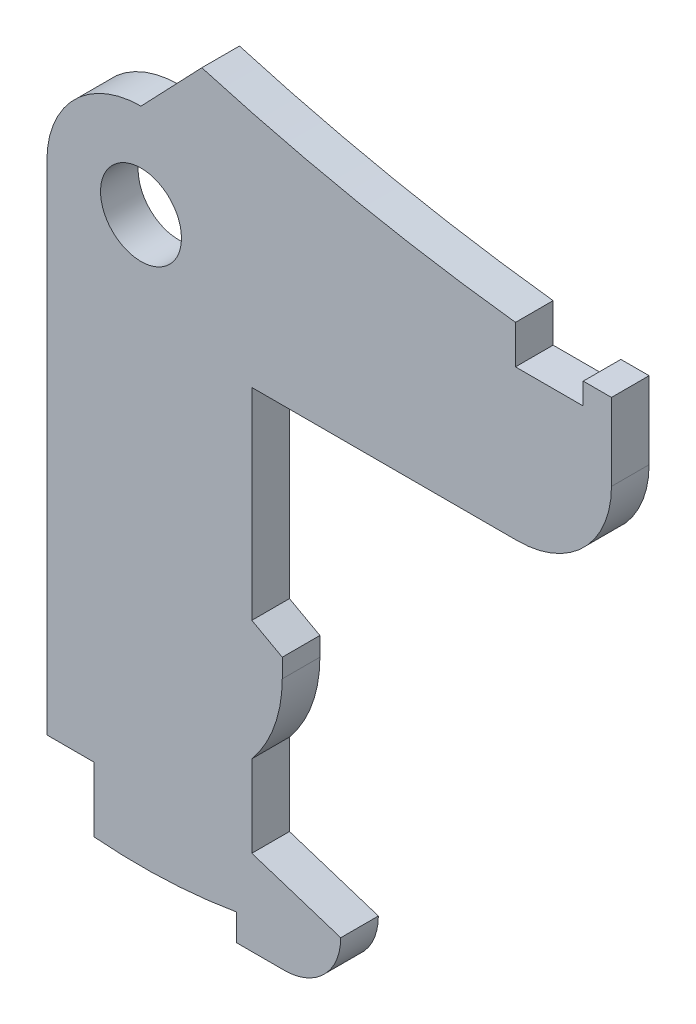
ISO-10303-21;
HEADER;
FILE_DESCRIPTION(('STEP AP214'),'2;1');
FILE_NAME('part.step','',(''),(''),'','','');
FILE_SCHEMA(('AUTOMOTIVE_DESIGN { 1 0 10303 214 1 1 1 1 }'));
ENDSEC;
DATA;
#1=APPLICATION_CONTEXT('core data for automotive mechanical design processes');
#2=APPLICATION_PROTOCOL_DEFINITION('international standard','automotive_design',2000,#1);
#3=PRODUCT_CONTEXT('',#1,'mechanical');
#4=PRODUCT('Part','Part','',(#3));
#5=PRODUCT_RELATED_PRODUCT_CATEGORY('part','',(#4));
#6=PRODUCT_DEFINITION_FORMATION('','',#4);
#7=PRODUCT_DEFINITION_CONTEXT('part definition',#1,'design');
#8=PRODUCT_DEFINITION('design','',#6,#7);
#9=PRODUCT_DEFINITION_SHAPE('','',#8);
#10=(LENGTH_UNIT() NAMED_UNIT(*) SI_UNIT(.MILLI.,.METRE.));
#11=(NAMED_UNIT(*) PLANE_ANGLE_UNIT() SI_UNIT($,.RADIAN.));
#12=(NAMED_UNIT(*) SI_UNIT($,.STERADIAN.) SOLID_ANGLE_UNIT());
#13=UNCERTAINTY_MEASURE_WITH_UNIT(LENGTH_MEASURE(1.E-05),#10,'distance_accuracy_value','');
#14=(GEOMETRIC_REPRESENTATION_CONTEXT(3) GLOBAL_UNCERTAINTY_ASSIGNED_CONTEXT((#13)) GLOBAL_UNIT_ASSIGNED_CONTEXT((#10,
#11,#12)) REPRESENTATION_CONTEXT('',''));
#15=CARTESIAN_POINT('',(0.,0.,0.));
#16=DIRECTION('',(0.,0.,1.));
#17=DIRECTION('',(1.,0.,0.));
#18=AXIS2_PLACEMENT_3D('',#15,#16,#17);
#19=CARTESIAN_POINT('',(0.,-69.1109493092821,2.));
#20=DIRECTION('',(0.,1.,0.));
#21=DIRECTION('',(0.,0.,1.));
#22=AXIS2_PLACEMENT_3D('',#19,#20,#21);
#23=PLANE('',#22);
#24=DIRECTION('',(1.,0.,0.));
#25=VECTOR('',#24,1.);
#26=CARTESIAN_POINT('',(0.,-69.1109493092821,0.));
#27=LINE('',#26,#25);
#28=CARTESIAN_POINT('',(58.5628566486414,-69.1109493092821,0.));
#29=VERTEX_POINT('',#28);
#30=CARTESIAN_POINT('',(61.1004317090133,-69.1109493092821,0.));
#31=VERTEX_POINT('',#30);
#32=EDGE_CURVE('E227',#29,#31,#27,.T.);
#33=ORIENTED_EDGE('',*,*,#32,.T.);
#34=DIRECTION('',(0.,0.,-1.));
#35=VECTOR('',#34,1.);
#36=CARTESIAN_POINT('',(61.1004317090133,-69.1109493092821,2.));
#37=LINE('',#36,#35);
#38=CARTESIAN_POINT('',(61.1004317090133,-69.1109493092821,2.));
#39=VERTEX_POINT('',#38);
#40=EDGE_CURVE('E11',#39,#31,#37,.T.);
#41=ORIENTED_EDGE('',*,*,#40,.F.);
#42=DIRECTION('',(1.,0.,0.));
#43=VECTOR('',#42,1.);
#44=CARTESIAN_POINT('',(0.,-69.1109493092821,2.));
#45=LINE('',#44,#43);
#46=CARTESIAN_POINT('',(58.5628566486414,-69.1109493092821,2.));
#47=VERTEX_POINT('',#46);
#48=EDGE_CURVE('E399',#47,#39,#45,.T.);
#49=ORIENTED_EDGE('',*,*,#48,.F.);
#50=DIRECTION('',(0.,0.,-1.));
#51=VECTOR('',#50,1.);
#52=CARTESIAN_POINT('',(58.5628566486414,-69.1109493092821,2.));
#53=LINE('',#52,#51);
#54=EDGE_CURVE('E223',#47,#29,#53,.T.);
#55=ORIENTED_EDGE('',*,*,#54,.T.);
#56=EDGE_LOOP('',(#33,#41,#49,#55));
#57=FACE_BOUND('',#56,.T.);
#58=ADVANCED_FACE('F35',(#57),#23,.F.);
#59=CARTESIAN_POINT('',(61.1004317090133,-66.1109493092821,2.));
#60=DIRECTION('',(0.,0.,-1.));
#61=DIRECTION('',(-1.,0.,0.));
#62=AXIS2_PLACEMENT_3D('',#59,#60,#61);
#63=CYLINDRICAL_SURFACE('',#62,3.00000000000001);
#64=CARTESIAN_POINT('',(61.1004317090133,-66.1109493092821,0.));
#65=DIRECTION('',(0.,0.,1.));
#66=DIRECTION('',(1.,0.,0.));
#67=AXIS2_PLACEMENT_3D('',#64,#65,#66);
#68=CIRCLE('',#67,3.00000000000001);
#69=CARTESIAN_POINT('',(64.1004317090133,-66.1109493092821,0.));
#70=VERTEX_POINT('',#69);
#71=EDGE_CURVE('E230',#31,#70,#68,.T.);
#72=ORIENTED_EDGE('',*,*,#71,.T.);
#73=DIRECTION('',(0.,0.,-1.));
#74=VECTOR('',#73,1.);
#75=CARTESIAN_POINT('',(64.1004317090133,-66.1109493092821,2.));
#76=LINE('',#75,#74);
#77=CARTESIAN_POINT('',(64.1004317090133,-66.1109493092821,2.));
#78=VERTEX_POINT('',#77);
#79=EDGE_CURVE('E44',#78,#70,#76,.T.);
#80=ORIENTED_EDGE('',*,*,#79,.F.);
#81=CARTESIAN_POINT('',(61.1004317090133,-66.1109493092821,2.));
#82=DIRECTION('',(0.,0.,1.));
#83=DIRECTION('',(1.,0.,0.));
#84=AXIS2_PLACEMENT_3D('',#81,#82,#83);
#85=CIRCLE('',#84,3.00000000000001);
#86=EDGE_CURVE('E139',#39,#78,#85,.T.);
#87=ORIENTED_EDGE('',*,*,#86,.F.);
#88=ORIENTED_EDGE('',*,*,#40,.T.);
#89=EDGE_LOOP('',(#72,#80,#87,#88));
#90=FACE_BOUND('',#89,.T.);
#91=ADVANCED_FACE('F413',(#90),#63,.T.);
#92=CARTESIAN_POINT('',(-13.2752413972475,-41.1476724947514,2.));
#93=DIRECTION('',(-0.307040459564451,-0.951696462213899,0.));
#94=DIRECTION('',(0.951696462213899,-0.307040459564451,0.));
#95=AXIS2_PLACEMENT_3D('',#92,#93,#94);
#96=PLANE('',#95);
#97=DIRECTION('',(-0.951696462213899,0.307040459564451,0.));
#98=VECTOR('',#97,1.);
#99=CARTESIAN_POINT('',(-13.2752413972475,-41.1476724947514,0.));
#100=LINE('',#99,#98);
#101=CARTESIAN_POINT('',(59.3761202637687,-64.5867713650885,0.));
#102=VERTEX_POINT('',#101);
#103=EDGE_CURVE('E232',#70,#102,#100,.T.);
#104=ORIENTED_EDGE('',*,*,#103,.T.);
#105=DIRECTION('',(0.,0.,-1.));
#106=VECTOR('',#105,1.);
#107=CARTESIAN_POINT('',(59.3761202637687,-64.5867713650885,2.));
#108=LINE('',#107,#106);
#109=CARTESIAN_POINT('',(59.3761202637687,-64.5867713650885,2.));
#110=VERTEX_POINT('',#109);
#111=EDGE_CURVE('E325',#110,#102,#108,.T.);
#112=ORIENTED_EDGE('',*,*,#111,.F.);
#113=DIRECTION('',(-0.951696462213899,0.307040459564451,0.));
#114=VECTOR('',#113,1.);
#115=CARTESIAN_POINT('',(-13.2752413972475,-41.1476724947514,2.));
#116=LINE('',#115,#114);
#117=EDGE_CURVE('E332',#78,#110,#116,.T.);
#118=ORIENTED_EDGE('',*,*,#117,.F.);
#119=ORIENTED_EDGE('',*,*,#79,.T.);
#120=EDGE_LOOP('',(#104,#112,#118,#119));
#121=FACE_BOUND('',#120,.T.);
#122=ADVANCED_FACE('F330',(#121),#96,.F.);
#123=CARTESIAN_POINT('',(59.3761202637687,0.,2.));
#124=DIRECTION('',(1.,0.,0.));
#125=DIRECTION('',(0.,0.,-1.));
#126=AXIS2_PLACEMENT_3D('',#123,#124,#125);
#127=PLANE('',#126);
#128=DIRECTION('',(0.,-1.,0.));
#129=VECTOR('',#128,1.);
#130=CARTESIAN_POINT('',(59.3761202637687,0.,0.));
#131=LINE('',#130,#129);
#132=CARTESIAN_POINT('',(59.3761202637687,-60.2400285328767,0.));
#133=VERTEX_POINT('',#132);
#134=EDGE_CURVE('E235',#133,#102,#131,.T.);
#135=ORIENTED_EDGE('',*,*,#134,.F.);
#136=DIRECTION('',(0.,0.,-1.));
#137=VECTOR('',#136,1.);
#138=CARTESIAN_POINT('',(59.3761202637687,-60.2400285328767,2.));
#139=LINE('',#138,#137);
#140=CARTESIAN_POINT('',(59.3761202637687,-60.2400285328767,2.));
#141=VERTEX_POINT('',#140);
#142=EDGE_CURVE('E323',#141,#133,#139,.T.);
#143=ORIENTED_EDGE('',*,*,#142,.F.);
#144=DIRECTION('',(0.,-1.,0.));
#145=VECTOR('',#144,1.);
#146=CARTESIAN_POINT('',(59.3761202637687,0.,2.));
#147=LINE('',#146,#145);
#148=EDGE_CURVE('E343',#141,#110,#147,.T.);
#149=ORIENTED_EDGE('',*,*,#148,.T.);
#150=ORIENTED_EDGE('',*,*,#111,.T.);
#151=EDGE_LOOP('',(#135,#143,#149,#150));
#152=FACE_BOUND('',#151,.T.);
#153=ADVANCED_FACE('F340',(#152),#127,.T.);
#154=CARTESIAN_POINT('',(53.95842090491,-55.7530720627505,2.));
#155=DIRECTION('',(0.,0.,-1.));
#156=DIRECTION('',(-1.,0.,0.));
#157=AXIS2_PLACEMENT_3D('',#154,#155,#156);
#158=CYLINDRICAL_SURFACE('',#157,7.03450387076339);
#159=CARTESIAN_POINT('',(53.95842090491,-55.7530720627505,0.));
#160=DIRECTION('',(0.,0.,1.));
#161=DIRECTION('',(1.,0.,0.));
#162=AXIS2_PLACEMENT_3D('',#159,#160,#161);
#163=CIRCLE('',#162,7.03450387076339);
#164=CARTESIAN_POINT('',(60.9929247756734,-55.7530720627505,0.));
#165=VERTEX_POINT('',#164);
#166=EDGE_CURVE('E238',#165,#133,#163,.F.);
#167=ORIENTED_EDGE('',*,*,#166,.F.);
#168=DIRECTION('',(0.,0.,-1.));
#169=VECTOR('',#168,1.);
#170=CARTESIAN_POINT('',(60.9929247756734,-55.7530720627505,2.));
#171=LINE('',#170,#169);
#172=CARTESIAN_POINT('',(60.9929247756734,-55.7530720627505,2.));
#173=VERTEX_POINT('',#172);
#174=EDGE_CURVE('E321',#173,#165,#171,.T.);
#175=ORIENTED_EDGE('',*,*,#174,.F.);
#176=CARTESIAN_POINT('',(53.95842090491,-55.7530720627505,2.));
#177=DIRECTION('',(0.,0.,1.));
#178=DIRECTION('',(1.,0.,0.));
#179=AXIS2_PLACEMENT_3D('',#176,#177,#178);
#180=CIRCLE('',#179,7.03450387076339);
#181=EDGE_CURVE('E346',#173,#141,#180,.F.);
#182=ORIENTED_EDGE('',*,*,#181,.T.);
#183=ORIENTED_EDGE('',*,*,#142,.T.);
#184=EDGE_LOOP('',(#167,#175,#182,#183));
#185=FACE_BOUND('',#184,.T.);
#186=ADVANCED_FACE('F423',(#185),#158,.T.);
#187=CARTESIAN_POINT('',(60.9929247756734,0.,2.));
#188=DIRECTION('',(-1.,0.,0.));
#189=DIRECTION('',(0.,0.,1.));
#190=AXIS2_PLACEMENT_3D('',#187,#188,#189);
#191=PLANE('',#190);
#192=DIRECTION('',(0.,1.,0.));
#193=VECTOR('',#192,1.);
#194=CARTESIAN_POINT('',(60.9929247756734,0.,0.));
#195=LINE('',#194,#193);
#196=CARTESIAN_POINT('',(60.9929247756734,-54.7553142853299,0.));
#197=VERTEX_POINT('',#196);
#198=EDGE_CURVE('E241',#165,#197,#195,.T.);
#199=ORIENTED_EDGE('',*,*,#198,.T.);
#200=DIRECTION('',(0.,0.,-1.));
#201=VECTOR('',#200,1.);
#202=CARTESIAN_POINT('',(60.9929247756734,-54.7553142853299,2.));
#203=LINE('',#202,#201);
#204=CARTESIAN_POINT('',(60.9929247756734,-54.7553142853299,2.));
#205=VERTEX_POINT('',#204);
#206=EDGE_CURVE('E318',#205,#197,#203,.T.);
#207=ORIENTED_EDGE('',*,*,#206,.F.);
#208=DIRECTION('',(0.,1.,0.));
#209=VECTOR('',#208,1.);
#210=CARTESIAN_POINT('',(60.9929247756734,0.,2.));
#211=LINE('',#210,#209);
#212=EDGE_CURVE('E348',#173,#205,#211,.T.);
#213=ORIENTED_EDGE('',*,*,#212,.F.);
#214=ORIENTED_EDGE('',*,*,#174,.T.);
#215=EDGE_LOOP('',(#199,#207,#213,#214));
#216=FACE_BOUND('',#215,.T.);
#217=ADVANCED_FACE('F426',(#216),#191,.F.);
#218=CARTESIAN_POINT('',(-8.97597044556049,-16.3550723728844,2.));
#219=DIRECTION('',(-0.481123509234274,-0.876652821168162,0.));
#220=DIRECTION('',(0.876652821168162,-0.481123509234274,0.));
#221=AXIS2_PLACEMENT_3D('',#218,#219,#220);
#222=PLANE('',#221);
#223=DIRECTION('',(-0.876652821168162,0.481123509234274,0.));
#224=VECTOR('',#223,1.);
#225=CARTESIAN_POINT('',(-8.97597044556049,-16.3550723728844,0.));
#226=LINE('',#225,#224);
#227=CARTESIAN_POINT('',(59.3761202637687,-53.8679816472202,0.));
#228=VERTEX_POINT('',#227);
#229=EDGE_CURVE('E243',#197,#228,#226,.T.);
#230=ORIENTED_EDGE('',*,*,#229,.T.);
#231=DIRECTION('',(0.,0.,-1.));
#232=VECTOR('',#231,1.);
#233=CARTESIAN_POINT('',(59.3761202637687,-53.8679816472202,2.));
#234=LINE('',#233,#232);
#235=CARTESIAN_POINT('',(59.3761202637687,-53.8679816472202,2.));
#236=VERTEX_POINT('',#235);
#237=EDGE_CURVE('E316',#236,#228,#234,.T.);
#238=ORIENTED_EDGE('',*,*,#237,.F.);
#239=DIRECTION('',(-0.876652821168162,0.481123509234274,0.));
#240=VECTOR('',#239,1.);
#241=CARTESIAN_POINT('',(-8.97597044556049,-16.3550723728844,2.));
#242=LINE('',#241,#240);
#243=EDGE_CURVE('E354',#205,#236,#242,.T.);
#244=ORIENTED_EDGE('',*,*,#243,.F.);
#245=ORIENTED_EDGE('',*,*,#206,.T.);
#246=EDGE_LOOP('',(#230,#238,#244,#245));
#247=FACE_BOUND('',#246,.T.);
#248=ADVANCED_FACE('F430',(#247),#222,.F.);
#249=CARTESIAN_POINT('',(59.3761202637687,0.,2.));
#250=DIRECTION('',(1.,0.,0.));
#251=DIRECTION('',(0.,0.,-1.));
#252=AXIS2_PLACEMENT_3D('',#249,#250,#251);
#253=PLANE('',#252);
#254=DIRECTION('',(0.,-1.,0.));
#255=VECTOR('',#254,1.);
#256=CARTESIAN_POINT('',(59.3761202637687,0.,0.));
#257=LINE('',#256,#255);
#258=CARTESIAN_POINT('',(59.3761202637687,-43.149191929352,0.));
#259=VERTEX_POINT('',#258);
#260=EDGE_CURVE('E246',#259,#228,#257,.T.);
#261=ORIENTED_EDGE('',*,*,#260,.F.);
#262=DIRECTION('',(0.,0.,-1.));
#263=VECTOR('',#262,1.);
#264=CARTESIAN_POINT('',(59.3761202637687,-43.149191929352,2.));
#265=LINE('',#264,#263);
#266=CARTESIAN_POINT('',(59.3761202637687,-43.149191929352,2.));
#267=VERTEX_POINT('',#266);
#268=EDGE_CURVE('E314',#267,#259,#265,.T.);
#269=ORIENTED_EDGE('',*,*,#268,.F.);
#270=DIRECTION('',(0.,-1.,0.));
#271=VECTOR('',#270,1.);
#272=CARTESIAN_POINT('',(59.3761202637687,0.,2.));
#273=LINE('',#272,#271);
#274=EDGE_CURVE('E356',#267,#236,#273,.T.);
#275=ORIENTED_EDGE('',*,*,#274,.T.);
#276=ORIENTED_EDGE('',*,*,#237,.T.);
#277=EDGE_LOOP('',(#261,#269,#275,#276));
#278=FACE_BOUND('',#277,.T.);
#279=ADVANCED_FACE('F434',(#278),#253,.T.);
#280=CARTESIAN_POINT('',(0.,-43.149191929352,2.));
#281=DIRECTION('',(0.,-1.,0.));
#282=DIRECTION('',(0.,0.,-1.));
#283=AXIS2_PLACEMENT_3D('',#280,#281,#282);
#284=PLANE('',#283);
#285=DIRECTION('',(-1.,0.,0.));
#286=VECTOR('',#285,1.);
#287=CARTESIAN_POINT('',(0.,-43.149191929352,0.));
#288=LINE('',#287,#286);
#289=CARTESIAN_POINT('',(73.4867153231227,-43.149191929352,0.));
#290=VERTEX_POINT('',#289);
#291=EDGE_CURVE('E249',#290,#259,#288,.T.);
#292=ORIENTED_EDGE('',*,*,#291,.F.);
#293=DIRECTION('',(0.,0.,-1.));
#294=VECTOR('',#293,1.);
#295=CARTESIAN_POINT('',(73.4867153231227,-43.149191929352,2.));
#296=LINE('',#295,#294);
#297=CARTESIAN_POINT('',(73.4867153231227,-43.149191929352,2.));
#298=VERTEX_POINT('',#297);
#299=EDGE_CURVE('E312',#298,#290,#296,.T.);
#300=ORIENTED_EDGE('',*,*,#299,.F.);
#301=DIRECTION('',(-1.,0.,0.));
#302=VECTOR('',#301,1.);
#303=CARTESIAN_POINT('',(0.,-43.149191929352,2.));
#304=LINE('',#303,#302);
#305=EDGE_CURVE('E359',#298,#267,#304,.T.);
#306=ORIENTED_EDGE('',*,*,#305,.T.);
#307=ORIENTED_EDGE('',*,*,#268,.T.);
#308=EDGE_LOOP('',(#292,#300,#306,#307));
#309=FACE_BOUND('',#308,.T.);
#310=ADVANCED_FACE('F438',(#309),#284,.T.);
#311=CARTESIAN_POINT('',(73.4867153231227,-38.149191929352,2.));
#312=DIRECTION('',(0.,0.,-1.));
#313=DIRECTION('',(-1.,0.,0.));
#314=AXIS2_PLACEMENT_3D('',#311,#312,#313);
#315=CYLINDRICAL_SURFACE('',#314,5.);
#316=CARTESIAN_POINT('',(73.4867153231227,-38.149191929352,0.));
#317=DIRECTION('',(0.,0.,1.));
#318=DIRECTION('',(1.,0.,0.));
#319=AXIS2_PLACEMENT_3D('',#316,#317,#318);
#320=CIRCLE('',#319,5.);
#321=CARTESIAN_POINT('',(78.4867153231227,-38.149191929352,0.));
#322=VERTEX_POINT('',#321);
#323=EDGE_CURVE('E252',#322,#290,#320,.F.);
#324=ORIENTED_EDGE('',*,*,#323,.F.);
#325=DIRECTION('',(0.,0.,-1.));
#326=VECTOR('',#325,1.);
#327=CARTESIAN_POINT('',(78.4867153231227,-38.149191929352,2.));
#328=LINE('',#327,#326);
#329=CARTESIAN_POINT('',(78.4867153231227,-38.149191929352,2.));
#330=VERTEX_POINT('',#329);
#331=EDGE_CURVE('E310',#330,#322,#328,.T.);
#332=ORIENTED_EDGE('',*,*,#331,.F.);
#333=CARTESIAN_POINT('',(73.4867153231227,-38.149191929352,2.));
#334=DIRECTION('',(0.,0.,1.));
#335=DIRECTION('',(1.,0.,0.));
#336=AXIS2_PLACEMENT_3D('',#333,#334,#335);
#337=CIRCLE('',#336,5.);
#338=EDGE_CURVE('E362',#330,#298,#337,.F.);
#339=ORIENTED_EDGE('',*,*,#338,.T.);
#340=ORIENTED_EDGE('',*,*,#299,.T.);
#341=EDGE_LOOP('',(#324,#332,#339,#340));
#342=FACE_BOUND('',#341,.T.);
#343=ADVANCED_FACE('F442',(#342),#315,.T.);
#344=CARTESIAN_POINT('',(78.4867153231227,0.,2.));
#345=DIRECTION('',(1.,0.,0.));
#346=DIRECTION('',(0.,0.,-1.));
#347=AXIS2_PLACEMENT_3D('',#344,#345,#346);
#348=PLANE('',#347);
#349=DIRECTION('',(0.,-1.,0.));
#350=VECTOR('',#349,1.);
#351=CARTESIAN_POINT('',(78.4867153231227,0.,0.));
#352=LINE('',#351,#350);
#353=CARTESIAN_POINT('',(78.4867153231227,-34.0532753395048,0.));
#354=VERTEX_POINT('',#353);
#355=EDGE_CURVE('E255',#354,#322,#352,.T.);
#356=ORIENTED_EDGE('',*,*,#355,.F.);
#357=DIRECTION('',(0.,0.,-1.));
#358=VECTOR('',#357,1.);
#359=CARTESIAN_POINT('',(78.4867153231227,-34.0532753395048,2.));
#360=LINE('',#359,#358);
#361=CARTESIAN_POINT('',(78.4867153231227,-34.0532753395048,2.));
#362=VERTEX_POINT('',#361);
#363=EDGE_CURVE('E308',#362,#354,#360,.T.);
#364=ORIENTED_EDGE('',*,*,#363,.F.);
#365=DIRECTION('',(0.,-1.,0.));
#366=VECTOR('',#365,1.);
#367=CARTESIAN_POINT('',(78.4867153231227,0.,2.));
#368=LINE('',#367,#366);
#369=EDGE_CURVE('E365',#362,#330,#368,.T.);
#370=ORIENTED_EDGE('',*,*,#369,.T.);
#371=ORIENTED_EDGE('',*,*,#331,.T.);
#372=EDGE_LOOP('',(#356,#364,#370,#371));
#373=FACE_BOUND('',#372,.T.);
#374=ADVANCED_FACE('F446',(#373),#348,.T.);
#375=CARTESIAN_POINT('',(0.,-34.0532753395048,2.));
#376=DIRECTION('',(0.,1.,0.));
#377=DIRECTION('',(0.,0.,1.));
#378=AXIS2_PLACEMENT_3D('',#375,#376,#377);
#379=PLANE('',#378);
#380=DIRECTION('',(1.,0.,0.));
#381=VECTOR('',#380,1.);
#382=CARTESIAN_POINT('',(0.,-34.0532753395048,0.));
#383=LINE('',#382,#381);
#384=CARTESIAN_POINT('',(76.9867153231227,-34.0532753395048,0.));
#385=VERTEX_POINT('',#384);
#386=EDGE_CURVE('E258',#385,#354,#383,.T.);
#387=ORIENTED_EDGE('',*,*,#386,.F.);
#388=DIRECTION('',(0.,0.,-1.));
#389=VECTOR('',#388,1.);
#390=CARTESIAN_POINT('',(76.9867153231227,-34.0532753395048,2.));
#391=LINE('',#390,#389);
#392=CARTESIAN_POINT('',(76.9867153231227,-34.0532753395048,2.));
#393=VERTEX_POINT('',#392);
#394=EDGE_CURVE('E306',#393,#385,#391,.T.);
#395=ORIENTED_EDGE('',*,*,#394,.F.);
#396=DIRECTION('',(1.,0.,0.));
#397=VECTOR('',#396,1.);
#398=CARTESIAN_POINT('',(0.,-34.0532753395048,2.));
#399=LINE('',#398,#397);
#400=EDGE_CURVE('E368',#393,#362,#399,.T.);
#401=ORIENTED_EDGE('',*,*,#400,.T.);
#402=ORIENTED_EDGE('',*,*,#363,.T.);
#403=EDGE_LOOP('',(#387,#395,#401,#402));
#404=FACE_BOUND('',#403,.T.);
#405=ADVANCED_FACE('F450',(#404),#379,.T.);
#406=CARTESIAN_POINT('',(76.9867153231227,0.,2.));
#407=DIRECTION('',(-1.,0.,0.));
#408=DIRECTION('',(0.,0.,1.));
#409=AXIS2_PLACEMENT_3D('',#406,#407,#408);
#410=PLANE('',#409);
#411=DIRECTION('',(0.,1.,0.));
#412=VECTOR('',#411,1.);
#413=CARTESIAN_POINT('',(76.9867153231227,0.,0.));
#414=LINE('',#413,#412);
#415=CARTESIAN_POINT('',(76.9867153231227,-35.1984634641797,0.));
#416=VERTEX_POINT('',#415);
#417=EDGE_CURVE('E261',#416,#385,#414,.T.);
#418=ORIENTED_EDGE('',*,*,#417,.F.);
#419=DIRECTION('',(0.,0.,-1.));
#420=VECTOR('',#419,1.);
#421=CARTESIAN_POINT('',(76.9867153231227,-35.1984634641797,2.));
#422=LINE('',#421,#420);
#423=CARTESIAN_POINT('',(76.9867153231227,-35.1984634641797,2.));
#424=VERTEX_POINT('',#423);
#425=EDGE_CURVE('E304',#424,#416,#422,.T.);
#426=ORIENTED_EDGE('',*,*,#425,.F.);
#427=DIRECTION('',(0.,1.,0.));
#428=VECTOR('',#427,1.);
#429=CARTESIAN_POINT('',(76.9867153231227,0.,2.));
#430=LINE('',#429,#428);
#431=EDGE_CURVE('E371',#424,#393,#430,.T.);
#432=ORIENTED_EDGE('',*,*,#431,.T.);
#433=ORIENTED_EDGE('',*,*,#394,.T.);
#434=EDGE_LOOP('',(#418,#426,#432,#433));
#435=FACE_BOUND('',#434,.T.);
#436=ADVANCED_FACE('F454',(#435),#410,.T.);
#437=CARTESIAN_POINT('',(0.,-35.1984634641797,2.));
#438=DIRECTION('',(0.,1.,0.));
#439=DIRECTION('',(0.,0.,1.));
#440=AXIS2_PLACEMENT_3D('',#437,#438,#439);
#441=PLANE('',#440);
#442=DIRECTION('',(1.,0.,0.));
#443=VECTOR('',#442,1.);
#444=CARTESIAN_POINT('',(0.,-35.1984634641797,0.));
#445=LINE('',#444,#443);
#446=CARTESIAN_POINT('',(73.3867153231227,-35.1984634641797,0.));
#447=VERTEX_POINT('',#446);
#448=EDGE_CURVE('E264',#447,#416,#445,.T.);
#449=ORIENTED_EDGE('',*,*,#448,.F.);
#450=DIRECTION('',(0.,0.,-1.));
#451=VECTOR('',#450,1.);
#452=CARTESIAN_POINT('',(73.3867153231227,-35.1984634641797,2.));
#453=LINE('',#452,#451);
#454=CARTESIAN_POINT('',(73.3867153231227,-35.1984634641797,2.));
#455=VERTEX_POINT('',#454);
#456=EDGE_CURVE('E302',#455,#447,#453,.T.);
#457=ORIENTED_EDGE('',*,*,#456,.F.);
#458=DIRECTION('',(1.,0.,0.));
#459=VECTOR('',#458,1.);
#460=CARTESIAN_POINT('',(0.,-35.1984634641797,2.));
#461=LINE('',#460,#459);
#462=EDGE_CURVE('E374',#455,#424,#461,.T.);
#463=ORIENTED_EDGE('',*,*,#462,.T.);
#464=ORIENTED_EDGE('',*,*,#425,.T.);
#465=EDGE_LOOP('',(#449,#457,#463,#464));
#466=FACE_BOUND('',#465,.T.);
#467=ADVANCED_FACE('F458',(#466),#441,.T.);
#468=CARTESIAN_POINT('',(73.3867153231227,0.,2.));
#469=DIRECTION('',(1.,0.,0.));
#470=DIRECTION('',(0.,0.,-1.));
#471=AXIS2_PLACEMENT_3D('',#468,#469,#470);
#472=PLANE('',#471);
#473=DIRECTION('',(0.,-1.,0.));
#474=VECTOR('',#473,1.);
#475=CARTESIAN_POINT('',(73.3867153231227,0.,0.));
#476=LINE('',#475,#474);
#477=CARTESIAN_POINT('',(73.3867153231227,-33.149191929352,0.));
#478=VERTEX_POINT('',#477);
#479=EDGE_CURVE('E267',#478,#447,#476,.T.);
#480=ORIENTED_EDGE('',*,*,#479,.F.);
#481=DIRECTION('',(0.,0.,-1.));
#482=VECTOR('',#481,1.);
#483=CARTESIAN_POINT('',(73.3867153231227,-33.149191929352,2.));
#484=LINE('',#483,#482);
#485=CARTESIAN_POINT('',(73.3867153231227,-33.149191929352,2.));
#486=VERTEX_POINT('',#485);
#487=EDGE_CURVE('E300',#486,#478,#484,.T.);
#488=ORIENTED_EDGE('',*,*,#487,.F.);
#489=DIRECTION('',(0.,-1.,0.));
#490=VECTOR('',#489,1.);
#491=CARTESIAN_POINT('',(73.3867153231227,0.,2.));
#492=LINE('',#491,#490);
#493=EDGE_CURVE('E377',#486,#455,#492,.T.);
#494=ORIENTED_EDGE('',*,*,#493,.T.);
#495=ORIENTED_EDGE('',*,*,#456,.T.);
#496=EDGE_LOOP('',(#480,#488,#494,#495));
#497=FACE_BOUND('',#496,.T.);
#498=ADVANCED_FACE('F462',(#497),#472,.T.);
#499=CARTESIAN_POINT('',(85.520841075924,69.3810826330756,2.));
#500=DIRECTION('',(0.,0.,-1.));
#501=DIRECTION('',(-1.,0.,0.));
#502=AXIS2_PLACEMENT_3D('',#499,#500,#501);
#503=CYLINDRICAL_SURFACE('',#502,103.245795118405);
#504=CARTESIAN_POINT('',(85.520841075924,69.3810826330756,0.));
#505=DIRECTION('',(0.,0.,1.));
#506=DIRECTION('',(1.,0.,0.));
#507=AXIS2_PLACEMENT_3D('',#504,#505,#506);
#508=CIRCLE('',#507,103.245795118405);
#509=CARTESIAN_POINT('',(56.718627508621,-29.7659127992372,0.));
#510=VERTEX_POINT('',#509);
#511=EDGE_CURVE('E270',#478,#510,#508,.F.);
#512=ORIENTED_EDGE('',*,*,#511,.T.);
#513=DIRECTION('',(0.,0.,-1.));
#514=VECTOR('',#513,1.);
#515=CARTESIAN_POINT('',(56.718627508621,-29.7659127992372,2.));
#516=LINE('',#515,#514);
#517=CARTESIAN_POINT('',(56.718627508621,-29.7659127992372,2.));
#518=VERTEX_POINT('',#517);
#519=EDGE_CURVE('E298',#518,#510,#516,.T.);
#520=ORIENTED_EDGE('',*,*,#519,.F.);
#521=CARTESIAN_POINT('',(85.520841075924,69.3810826330756,2.));
#522=DIRECTION('',(0.,0.,1.));
#523=DIRECTION('',(1.,0.,0.));
#524=AXIS2_PLACEMENT_3D('',#521,#522,#523);
#525=CIRCLE('',#524,103.245795118405);
#526=EDGE_CURVE('E380',#486,#518,#525,.F.);
#527=ORIENTED_EDGE('',*,*,#526,.F.);
#528=ORIENTED_EDGE('',*,*,#487,.T.);
#529=EDGE_LOOP('',(#512,#520,#527,#528));
#530=FACE_BOUND('',#529,.T.);
#531=ADVANCED_FACE('F466',(#530),#503,.F.);
#532=CARTESIAN_POINT('',(44.5238341929609,-42.5318505329619,2.));
#533=DIRECTION('',(-0.723097327047915,0.690746158596745,0.));
#534=DIRECTION('',(-0.690746158596745,-0.723097327047916,0.));
#535=AXIS2_PLACEMENT_3D('',#532,#533,#534);
#536=PLANE('',#535);
#537=DIRECTION('',(0.690746158596745,0.723097327047916,0.));
#538=VECTOR('',#537,1.);
#539=CARTESIAN_POINT('',(44.5238341929609,-42.5318505329619,0.));
#540=LINE('',#539,#538);
#541=CARTESIAN_POINT('',(53.4867153231227,-33.149191929352,0.));
#542=VERTEX_POINT('',#541);
#543=EDGE_CURVE('E273',#542,#510,#540,.T.);
#544=ORIENTED_EDGE('',*,*,#543,.F.);
#545=DIRECTION('',(0.,0.,-1.));
#546=VECTOR('',#545,1.);
#547=CARTESIAN_POINT('',(53.4867153231227,-33.149191929352,2.));
#548=LINE('',#547,#546);
#549=CARTESIAN_POINT('',(53.4867153231227,-33.149191929352,2.));
#550=VERTEX_POINT('',#549);
#551=EDGE_CURVE('E296',#550,#542,#548,.T.);
#552=ORIENTED_EDGE('',*,*,#551,.F.);
#553=DIRECTION('',(0.690746158596745,0.723097327047916,0.));
#554=VECTOR('',#553,1.);
#555=CARTESIAN_POINT('',(44.5238341929609,-42.5318505329619,2.));
#556=LINE('',#555,#554);
#557=EDGE_CURVE('E382',#550,#518,#556,.T.);
#558=ORIENTED_EDGE('',*,*,#557,.T.);
#559=ORIENTED_EDGE('',*,*,#519,.T.);
#560=EDGE_LOOP('',(#544,#552,#558,#559));
#561=FACE_BOUND('',#560,.T.);
#562=ADVANCED_FACE('F470',(#561),#536,.T.);
#563=CARTESIAN_POINT('',(53.4867153231227,-38.149191929352,2.));
#564=DIRECTION('',(0.,0.,-1.));
#565=DIRECTION('',(-1.,0.,0.));
#566=AXIS2_PLACEMENT_3D('',#563,#564,#565);
#567=CYLINDRICAL_SURFACE('',#566,5.);
#568=CARTESIAN_POINT('',(53.4867153231227,-38.149191929352,0.));
#569=DIRECTION('',(0.,0.,1.));
#570=DIRECTION('',(1.,0.,0.));
#571=AXIS2_PLACEMENT_3D('',#568,#569,#570);
#572=CIRCLE('',#571,5.);
#573=CARTESIAN_POINT('',(48.4867153231227,-38.149191929352,0.));
#574=VERTEX_POINT('',#573);
#575=EDGE_CURVE('E276',#542,#574,#572,.T.);
#576=ORIENTED_EDGE('',*,*,#575,.T.);
#577=DIRECTION('',(0.,0.,-1.));
#578=VECTOR('',#577,1.);
#579=CARTESIAN_POINT('',(48.4867153231227,-38.149191929352,2.));
#580=LINE('',#579,#578);
#581=CARTESIAN_POINT('',(48.4867153231227,-38.149191929352,2.));
#582=VERTEX_POINT('',#581);
#583=EDGE_CURVE('E294',#582,#574,#580,.T.);
#584=ORIENTED_EDGE('',*,*,#583,.F.);
#585=CARTESIAN_POINT('',(53.4867153231227,-38.149191929352,2.));
#586=DIRECTION('',(0.,0.,1.));
#587=DIRECTION('',(1.,0.,0.));
#588=AXIS2_PLACEMENT_3D('',#585,#586,#587);
#589=CIRCLE('',#588,5.);
#590=EDGE_CURVE('E385',#550,#582,#589,.T.);
#591=ORIENTED_EDGE('',*,*,#590,.F.);
#592=ORIENTED_EDGE('',*,*,#551,.T.);
#593=EDGE_LOOP('',(#576,#584,#591,#592));
#594=FACE_BOUND('',#593,.T.);
#595=ADVANCED_FACE('F474',(#594),#567,.T.);
#596=CARTESIAN_POINT('',(48.4867153231227,0.,2.));
#597=DIRECTION('',(-1.,0.,0.));
#598=DIRECTION('',(0.,0.,1.));
#599=AXIS2_PLACEMENT_3D('',#596,#597,#598);
#600=PLANE('',#599);
#601=DIRECTION('',(0.,1.,0.));
#602=VECTOR('',#601,1.);
#603=CARTESIAN_POINT('',(48.4867153231227,0.,0.));
#604=LINE('',#603,#602);
#605=CARTESIAN_POINT('',(48.4867153231227,-64.5868697545103,0.));
#606=VERTEX_POINT('',#605);
#607=EDGE_CURVE('E279',#606,#574,#604,.T.);
#608=ORIENTED_EDGE('',*,*,#607,.F.);
#609=DIRECTION('',(0.,0.,-1.));
#610=VECTOR('',#609,1.);
#611=CARTESIAN_POINT('',(48.4867153231227,-64.5868697545103,2.));
#612=LINE('',#611,#610);
#613=CARTESIAN_POINT('',(48.4867153231227,-64.5868697545103,2.));
#614=VERTEX_POINT('',#613);
#615=EDGE_CURVE('E292',#614,#606,#612,.T.);
#616=ORIENTED_EDGE('',*,*,#615,.F.);
#617=DIRECTION('',(0.,1.,0.));
#618=VECTOR('',#617,1.);
#619=CARTESIAN_POINT('',(48.4867153231227,0.,2.));
#620=LINE('',#619,#618);
#621=EDGE_CURVE('E218',#614,#582,#620,.T.);
#622=ORIENTED_EDGE('',*,*,#621,.T.);
#623=ORIENTED_EDGE('',*,*,#583,.T.);
#624=EDGE_LOOP('',(#608,#616,#622,#623));
#625=FACE_BOUND('',#624,.T.);
#626=ADVANCED_FACE('F389',(#625),#600,.T.);
#627=CARTESIAN_POINT('',(0.,-64.5868697545103,2.));
#628=DIRECTION('',(0.,-1.,0.));
#629=DIRECTION('',(0.,0.,-1.));
#630=AXIS2_PLACEMENT_3D('',#627,#628,#629);
#631=PLANE('',#630);
#632=DIRECTION('',(-1.,0.,0.));
#633=VECTOR('',#632,1.);
#634=CARTESIAN_POINT('',(0.,-64.5868697545103,0.));
#635=LINE('',#634,#633);
#636=CARTESIAN_POINT('',(50.9867153231227,-64.5868697545103,0.));
#637=VERTEX_POINT('',#636);
#638=EDGE_CURVE('E282',#637,#606,#635,.T.);
#639=ORIENTED_EDGE('',*,*,#638,.F.);
#640=DIRECTION('',(0.,0.,-1.));
#641=VECTOR('',#640,1.);
#642=CARTESIAN_POINT('',(50.9867153231227,-64.5868697545103,2.));
#643=LINE('',#642,#641);
#644=CARTESIAN_POINT('',(50.9867153231227,-64.5868697545103,2.));
#645=VERTEX_POINT('',#644);
#646=EDGE_CURVE('E206',#645,#637,#643,.T.);
#647=ORIENTED_EDGE('',*,*,#646,.F.);
#648=DIRECTION('',(-1.,0.,0.));
#649=VECTOR('',#648,1.);
#650=CARTESIAN_POINT('',(0.,-64.5868697545103,2.));
#651=LINE('',#650,#649);
#652=EDGE_CURVE('E216',#645,#614,#651,.T.);
#653=ORIENTED_EDGE('',*,*,#652,.T.);
#654=ORIENTED_EDGE('',*,*,#615,.T.);
#655=EDGE_LOOP('',(#639,#647,#653,#654));
#656=FACE_BOUND('',#655,.T.);
#657=ADVANCED_FACE('F395',(#656),#631,.T.);
#658=CARTESIAN_POINT('',(50.9867153231227,0.,2.));
#659=DIRECTION('',(-1.,0.,0.));
#660=DIRECTION('',(0.,0.,1.));
#661=AXIS2_PLACEMENT_3D('',#658,#659,#660);
#662=PLANE('',#661);
#663=DIRECTION('',(0.,1.,0.));
#664=VECTOR('',#663,1.);
#665=CARTESIAN_POINT('',(50.9867153231227,0.,0.));
#666=LINE('',#665,#664);
#667=CARTESIAN_POINT('',(50.9867153231227,-68.0236662622613,0.));
#668=VERTEX_POINT('',#667);
#669=EDGE_CURVE('E205',#668,#637,#666,.T.);
#670=ORIENTED_EDGE('',*,*,#669,.F.);
#671=DIRECTION('',(0.,0.,-1.));
#672=VECTOR('',#671,1.);
#673=CARTESIAN_POINT('',(50.9867153231227,-68.0236662622613,2.));
#674=LINE('',#673,#672);
#675=CARTESIAN_POINT('',(50.9867153231227,-68.0236662622613,2.));
#676=VERTEX_POINT('',#675);
#677=EDGE_CURVE('E199',#676,#668,#674,.T.);
#678=ORIENTED_EDGE('',*,*,#677,.F.);
#679=DIRECTION('',(0.,1.,0.));
#680=VECTOR('',#679,1.);
#681=CARTESIAN_POINT('',(50.9867153231227,0.,2.));
#682=LINE('',#681,#680);
#683=EDGE_CURVE('E203',#676,#645,#682,.T.);
#684=ORIENTED_EDGE('',*,*,#683,.T.);
#685=ORIENTED_EDGE('',*,*,#646,.T.);
#686=EDGE_LOOP('',(#670,#678,#684,#685));
#687=FACE_BOUND('',#686,.T.);
#688=ADVANCED_FACE('F201',(#687),#662,.T.);
#689=CARTESIAN_POINT('',(53.4867153231227,-38.149191929352,2.));
#690=DIRECTION('',(0.,0.,-1.));
#691=DIRECTION('',(-1.,0.,0.));
#692=AXIS2_PLACEMENT_3D('',#689,#690,#691);
#693=CYLINDRICAL_SURFACE('',#692,29.9788961882798);
#694=CARTESIAN_POINT('',(53.4867153231227,-38.149191929352,0.));
#695=DIRECTION('',(0.,0.,1.));
#696=DIRECTION('',(1.,0.,0.));
#697=AXIS2_PLACEMENT_3D('',#694,#695,#696);
#698=CIRCLE('',#697,29.9788961882798);
#699=CARTESIAN_POINT('',(58.5628566486414,-67.6952069891028,0.));
#700=VERTEX_POINT('',#699);
#701=EDGE_CURVE('E125',#668,#700,#698,.T.);
#702=ORIENTED_EDGE('',*,*,#701,.T.);
#703=DIRECTION('',(0.,0.,-1.));
#704=VECTOR('',#703,1.);
#705=CARTESIAN_POINT('',(58.5628566486414,-67.6952069891028,2.));
#706=LINE('',#705,#704);
#707=CARTESIAN_POINT('',(58.5628566486414,-67.6952069891028,2.));
#708=VERTEX_POINT('',#707);
#709=EDGE_CURVE('E207',#708,#700,#706,.T.);
#710=ORIENTED_EDGE('',*,*,#709,.F.);
#711=CARTESIAN_POINT('',(53.4867153231227,-38.149191929352,2.));
#712=DIRECTION('',(0.,0.,1.));
#713=DIRECTION('',(1.,0.,0.));
#714=AXIS2_PLACEMENT_3D('',#711,#712,#713);
#715=CIRCLE('',#714,29.9788961882798);
#716=EDGE_CURVE('E209',#676,#708,#715,.T.);
#717=ORIENTED_EDGE('',*,*,#716,.F.);
#718=ORIENTED_EDGE('',*,*,#677,.T.);
#719=EDGE_LOOP('',(#702,#710,#717,#718));
#720=FACE_BOUND('',#719,.T.);
#721=ADVANCED_FACE('F210',(#720),#693,.T.);
#722=CARTESIAN_POINT('',(53.4867153231227,-38.149191929352,2.));
#723=DIRECTION('',(0.,0.,-1.));
#724=DIRECTION('',(-1.,0.,0.));
#725=AXIS2_PLACEMENT_3D('',#722,#723,#724);
#726=CYLINDRICAL_SURFACE('',#725,2.15);
#727=CARTESIAN_POINT('',(53.4867153231227,-38.149191929352,2.));
#728=DIRECTION('',(0.,0.,1.));
#729=DIRECTION('',(1.,0.,0.));
#730=AXIS2_PLACEMENT_3D('',#727,#728,#729);
#731=CIRCLE('',#730,2.15);
#732=CARTESIAN_POINT('',(55.6367153231227,-38.149191929352,2.));
#733=VERTEX_POINT('',#732);
#734=EDGE_CURVE('E288',#733,#733,#731,.T.);
#735=ORIENTED_EDGE('',*,*,#734,.T.);
#736=EDGE_LOOP('',(#735));
#737=FACE_BOUND('',#736,.T.);
#738=CARTESIAN_POINT('',(53.4867153231227,-38.149191929352,0.));
#739=DIRECTION('',(0.,0.,1.));
#740=DIRECTION('',(1.,0.,0.));
#741=AXIS2_PLACEMENT_3D('',#738,#739,#740);
#742=CIRCLE('',#741,2.15);
#743=CARTESIAN_POINT('',(55.6367153231227,-38.149191929352,0.));
#744=VERTEX_POINT('',#743);
#745=EDGE_CURVE('E224',#744,#744,#742,.T.);
#746=ORIENTED_EDGE('',*,*,#745,.F.);
#747=EDGE_LOOP('',(#746));
#748=FACE_BOUND('',#747,.T.);
#749=ADVANCED_FACE('F37',(#737,#748),#726,.F.);
#750=CARTESIAN_POINT('',(58.5628566486414,0.,2.));
#751=DIRECTION('',(1.,0.,0.));
#752=DIRECTION('',(0.,0.,-1.));
#753=AXIS2_PLACEMENT_3D('',#750,#751,#752);
#754=PLANE('',#753);
#755=DIRECTION('',(0.,-1.,0.));
#756=VECTOR('',#755,1.);
#757=CARTESIAN_POINT('',(58.5628566486414,0.,0.));
#758=LINE('',#757,#756);
#759=EDGE_CURVE('E131',#700,#29,#758,.T.);
#760=ORIENTED_EDGE('',*,*,#759,.T.);
#761=ORIENTED_EDGE('',*,*,#54,.F.);
#762=DIRECTION('',(0.,-1.,0.));
#763=VECTOR('',#762,1.);
#764=CARTESIAN_POINT('',(58.5628566486414,0.,2.));
#765=LINE('',#764,#763);
#766=EDGE_CURVE('E52',#708,#47,#765,.T.);
#767=ORIENTED_EDGE('',*,*,#766,.F.);
#768=ORIENTED_EDGE('',*,*,#709,.T.);
#769=EDGE_LOOP('',(#760,#761,#767,#768));
#770=FACE_BOUND('',#769,.T.);
#771=ADVANCED_FACE('F400',(#770),#754,.F.);
#772=CARTESIAN_POINT('',(0.,0.,2.));
#773=DIRECTION('',(0.,0.,1.));
#774=DIRECTION('',(1.,0.,0.));
#775=AXIS2_PLACEMENT_3D('',#772,#773,#774);
#776=PLANE('',#775);
#777=ORIENTED_EDGE('',*,*,#734,.F.);
#778=EDGE_LOOP('',(#777));
#779=FACE_BOUND('',#778,.T.);
#780=ORIENTED_EDGE('',*,*,#48,.T.);
#781=ORIENTED_EDGE('',*,*,#86,.T.);
#782=ORIENTED_EDGE('',*,*,#117,.T.);
#783=ORIENTED_EDGE('',*,*,#148,.F.);
#784=ORIENTED_EDGE('',*,*,#181,.F.);
#785=ORIENTED_EDGE('',*,*,#212,.T.);
#786=ORIENTED_EDGE('',*,*,#243,.T.);
#787=ORIENTED_EDGE('',*,*,#274,.F.);
#788=ORIENTED_EDGE('',*,*,#305,.F.);
#789=ORIENTED_EDGE('',*,*,#338,.F.);
#790=ORIENTED_EDGE('',*,*,#369,.F.);
#791=ORIENTED_EDGE('',*,*,#400,.F.);
#792=ORIENTED_EDGE('',*,*,#431,.F.);
#793=ORIENTED_EDGE('',*,*,#462,.F.);
#794=ORIENTED_EDGE('',*,*,#493,.F.);
#795=ORIENTED_EDGE('',*,*,#526,.T.);
#796=ORIENTED_EDGE('',*,*,#557,.F.);
#797=ORIENTED_EDGE('',*,*,#590,.T.);
#798=ORIENTED_EDGE('',*,*,#621,.F.);
#799=ORIENTED_EDGE('',*,*,#652,.F.);
#800=ORIENTED_EDGE('',*,*,#683,.F.);
#801=ORIENTED_EDGE('',*,*,#716,.T.);
#802=ORIENTED_EDGE('',*,*,#766,.T.);
#803=EDGE_LOOP('',(#780,#781,#782,#783,#784,#785,#786,#787,#788,#789,#790,#791,#792,#793,#794,
#795,#796,#797,#798,#799,#800,#801,#802));
#804=FACE_BOUND('',#803,.T.);
#805=ADVANCED_FACE('F213',(#779,#804),#776,.T.);
#806=CARTESIAN_POINT('',(0.,0.,0.));
#807=DIRECTION('',(0.,0.,1.));
#808=DIRECTION('',(1.,0.,0.));
#809=AXIS2_PLACEMENT_3D('',#806,#807,#808);
#810=PLANE('',#809);
#811=ORIENTED_EDGE('',*,*,#745,.T.);
#812=EDGE_LOOP('',(#811));
#813=FACE_BOUND('',#812,.T.);
#814=ORIENTED_EDGE('',*,*,#32,.F.);
#815=ORIENTED_EDGE('',*,*,#759,.F.);
#816=ORIENTED_EDGE('',*,*,#701,.F.);
#817=ORIENTED_EDGE('',*,*,#669,.T.);
#818=ORIENTED_EDGE('',*,*,#638,.T.);
#819=ORIENTED_EDGE('',*,*,#607,.T.);
#820=ORIENTED_EDGE('',*,*,#575,.F.);
#821=ORIENTED_EDGE('',*,*,#543,.T.);
#822=ORIENTED_EDGE('',*,*,#511,.F.);
#823=ORIENTED_EDGE('',*,*,#479,.T.);
#824=ORIENTED_EDGE('',*,*,#448,.T.);
#825=ORIENTED_EDGE('',*,*,#417,.T.);
#826=ORIENTED_EDGE('',*,*,#386,.T.);
#827=ORIENTED_EDGE('',*,*,#355,.T.);
#828=ORIENTED_EDGE('',*,*,#323,.T.);
#829=ORIENTED_EDGE('',*,*,#291,.T.);
#830=ORIENTED_EDGE('',*,*,#260,.T.);
#831=ORIENTED_EDGE('',*,*,#229,.F.);
#832=ORIENTED_EDGE('',*,*,#198,.F.);
#833=ORIENTED_EDGE('',*,*,#166,.T.);
#834=ORIENTED_EDGE('',*,*,#134,.T.);
#835=ORIENTED_EDGE('',*,*,#103,.F.);
#836=ORIENTED_EDGE('',*,*,#71,.F.);
#837=EDGE_LOOP('',(#814,#815,#816,#817,#818,#819,#820,#821,#822,#823,#824,#825,#826,#827,#828,
#829,#830,#831,#832,#833,#834,#835,#836));
#838=FACE_BOUND('',#837,.T.);
#839=ADVANCED_FACE('F335',(#813,#838),#810,.F.);
#840=CLOSED_SHELL('',(#58,#91,#122,#153,#186,#217,#248,#279,#310,#343,#374,#405,#436,#467,#498,
#531,#562,#595,#626,#657,#688,#721,#749,#771,#805,#839));
#841=MANIFOLD_SOLID_BREP('B2',#840);
#842=ADVANCED_BREP_SHAPE_REPRESENTATION('',(#18,#841),#14);
#843=SHAPE_DEFINITION_REPRESENTATION(#9,#842);
ENDSEC;
END-ISO-10303-21;
